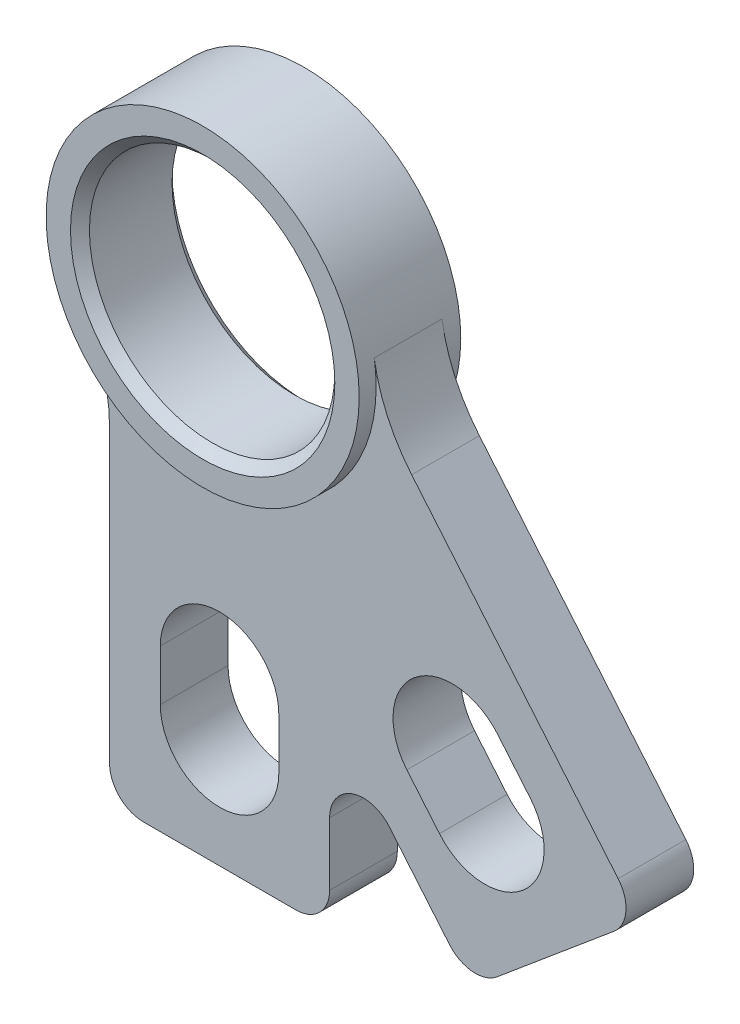
ISO-10303-21;
HEADER;
FILE_DESCRIPTION(('STEP AP214'),'2;1');
FILE_NAME('part.step','',(''),(''),'','','');
FILE_SCHEMA(('AUTOMOTIVE_DESIGN { 1 0 10303 214 1 1 1 1 }'));
ENDSEC;
DATA;
#1=APPLICATION_CONTEXT('core data for automotive mechanical design processes');
#2=APPLICATION_PROTOCOL_DEFINITION('international standard','automotive_design',2000,#1);
#3=PRODUCT_CONTEXT('',#1,'mechanical');
#4=PRODUCT('Part','Part','',(#3));
#5=PRODUCT_RELATED_PRODUCT_CATEGORY('part','',(#4));
#6=PRODUCT_DEFINITION_FORMATION('','',#4);
#7=PRODUCT_DEFINITION_CONTEXT('part definition',#1,'design');
#8=PRODUCT_DEFINITION('design','',#6,#7);
#9=PRODUCT_DEFINITION_SHAPE('','',#8);
#10=(LENGTH_UNIT() NAMED_UNIT(*) SI_UNIT(.MILLI.,.METRE.));
#11=(NAMED_UNIT(*) PLANE_ANGLE_UNIT() SI_UNIT($,.RADIAN.));
#12=(NAMED_UNIT(*) SI_UNIT($,.STERADIAN.) SOLID_ANGLE_UNIT());
#13=UNCERTAINTY_MEASURE_WITH_UNIT(LENGTH_MEASURE(1.E-05),#10,'distance_accuracy_value','');
#14=(GEOMETRIC_REPRESENTATION_CONTEXT(3) GLOBAL_UNCERTAINTY_ASSIGNED_CONTEXT((#13)) GLOBAL_UNIT_ASSIGNED_CONTEXT((#10,
#11,#12)) REPRESENTATION_CONTEXT('',''));
#15=CARTESIAN_POINT('',(0.,0.,0.));
#16=DIRECTION('',(0.,0.,1.));
#17=DIRECTION('',(1.,0.,0.));
#18=AXIS2_PLACEMENT_3D('',#15,#16,#17);
#19=CARTESIAN_POINT('',(0.,0.,4.7625));
#20=DIRECTION('',(0.,0.,-1.));
#21=DIRECTION('',(-1.,0.,0.));
#22=AXIS2_PLACEMENT_3D('',#19,#20,#21);
#23=CYLINDRICAL_SURFACE('',#22,11.5062);
#24=CARTESIAN_POINT('',(0.,0.,-3.87350000000002));
#25=DIRECTION('',(0.,0.,1.));
#26=DIRECTION('',(1.,0.,0.));
#27=AXIS2_PLACEMENT_3D('',#24,#25,#26);
#28=CIRCLE('',#27,11.5062);
#29=CARTESIAN_POINT('',(-11.5062,0.,-3.87350000000002));
#30=VERTEX_POINT('',#29);
#31=EDGE_CURVE('E44',#30,#30,#28,.F.);
#32=CARTESIAN_POINT('',(0.,0.,3.87349999999996));
#33=DIRECTION('',(0.,0.,1.));
#34=DIRECTION('',(1.,0.,0.));
#35=AXIS2_PLACEMENT_3D('',#32,#33,#34);
#36=CIRCLE('',#35,11.5062);
#37=CARTESIAN_POINT('',(-11.5062,0.,3.87349999999996));
#38=VERTEX_POINT('',#37);
#39=EDGE_CURVE('E372',#38,#38,#36,.T.);
#40=CARTESIAN_POINT('',(-11.5062,0.,-3.87350000000002));
#41=CARTESIAN_POINT('',(-11.5062,0.,-3.79280208333335));
#42=CARTESIAN_POINT('',(-11.5062,0.,-3.71210416666668));
#43=CARTESIAN_POINT('',(-11.5062,0.,-3.55070833333335));
#44=CARTESIAN_POINT('',(-11.5062,0.,-3.47001041666668));
#45=CARTESIAN_POINT('',(-11.5062,0.,-3.30861458333335));
#46=CARTESIAN_POINT('',(-11.5062,0.,-3.22791666666669));
#47=CARTESIAN_POINT('',(-11.5062,0.,-3.06652083333335));
#48=CARTESIAN_POINT('',(-11.5062,0.,-2.98582291666669));
#49=CARTESIAN_POINT('',(-11.5062,0.,-2.82442708333335));
#50=CARTESIAN_POINT('',(-11.5062,0.,-2.74372916666669));
#51=CARTESIAN_POINT('',(-11.5062,0.,-2.58233333333335));
#52=CARTESIAN_POINT('',(-11.5062,0.,-2.50163541666669));
#53=CARTESIAN_POINT('',(-11.5062,0.,-2.34023958333336));
#54=CARTESIAN_POINT('',(-11.5062,0.,-2.25954166666669));
#55=CARTESIAN_POINT('',(-11.5062,0.,-2.09814583333336));
#56=CARTESIAN_POINT('',(-11.5062,0.,-2.01744791666669));
#57=CARTESIAN_POINT('',(-11.5062,0.,-1.85605208333336));
#58=CARTESIAN_POINT('',(-11.5062,0.,-1.77535416666669));
#59=CARTESIAN_POINT('',(-11.5062,0.,-1.61395833333336));
#60=CARTESIAN_POINT('',(-11.5062,0.,-1.53326041666669));
#61=CARTESIAN_POINT('',(-11.5062,0.,-1.37186458333336));
#62=CARTESIAN_POINT('',(-11.5062,0.,-1.29116666666669));
#63=CARTESIAN_POINT('',(-11.5062,0.,-1.12977083333336));
#64=CARTESIAN_POINT('',(-11.5062,0.,-1.04907291666669));
#65=CARTESIAN_POINT('',(-11.5062,0.,-0.887677083333361));
#66=CARTESIAN_POINT('',(-11.5062,0.,-0.806979166666695));
#67=CARTESIAN_POINT('',(-11.5062,0.,-0.645583333333362));
#68=CARTESIAN_POINT('',(-11.5062,0.,-0.564885416666695));
#69=CARTESIAN_POINT('',(-11.5062,0.,-0.403489583333362));
#70=CARTESIAN_POINT('',(-11.5062,0.,-0.322791666666696));
#71=CARTESIAN_POINT('',(-11.5062,0.,-0.161395833333363));
#72=CARTESIAN_POINT('',(-11.5062,0.,-0.0806979166666968));
#73=CARTESIAN_POINT('',(-11.5062,0.,0.0806979166666361));
#74=CARTESIAN_POINT('',(-11.5062,0.,0.161395833333302));
#75=CARTESIAN_POINT('',(-11.5062,0.,0.322791666666635));
#76=CARTESIAN_POINT('',(-11.5062,0.,0.403489583333302));
#77=CARTESIAN_POINT('',(-11.5062,0.,0.564885416666635));
#78=CARTESIAN_POINT('',(-11.5062,0.,0.645583333333301));
#79=CARTESIAN_POINT('',(-11.5062,0.,0.806979166666634));
#80=CARTESIAN_POINT('',(-11.5062,0.,0.8876770833333));
#81=CARTESIAN_POINT('',(-11.5062,0.,1.04907291666663));
#82=CARTESIAN_POINT('',(-11.5062,0.,1.1297708333333));
#83=CARTESIAN_POINT('',(-11.5062,0.,1.29116666666663));
#84=CARTESIAN_POINT('',(-11.5062,0.,1.3718645833333));
#85=CARTESIAN_POINT('',(-11.5062,0.,1.53326041666663));
#86=CARTESIAN_POINT('',(-11.5062,0.,1.6139583333333));
#87=CARTESIAN_POINT('',(-11.5062,0.,1.77535416666663));
#88=CARTESIAN_POINT('',(-11.5062,0.,1.8560520833333));
#89=CARTESIAN_POINT('',(-11.5062,0.,2.01744791666663));
#90=CARTESIAN_POINT('',(-11.5062,0.,2.0981458333333));
#91=CARTESIAN_POINT('',(-11.5062,0.,2.25954166666663));
#92=CARTESIAN_POINT('',(-11.5062,0.,2.34023958333329));
#93=CARTESIAN_POINT('',(-11.5062,0.,2.50163541666663));
#94=CARTESIAN_POINT('',(-11.5062,0.,2.58233333333329));
#95=CARTESIAN_POINT('',(-11.5062,0.,2.74372916666663));
#96=CARTESIAN_POINT('',(-11.5062,0.,2.82442708333329));
#97=CARTESIAN_POINT('',(-11.5062,0.,2.98582291666663));
#98=CARTESIAN_POINT('',(-11.5062,0.,3.06652083333329));
#99=CARTESIAN_POINT('',(-11.5062,0.,3.22791666666662));
#100=CARTESIAN_POINT('',(-11.5062,0.,3.30861458333329));
#101=CARTESIAN_POINT('',(-11.5062,0.,3.47001041666662));
#102=CARTESIAN_POINT('',(-11.5062,0.,3.55070833333329));
#103=CARTESIAN_POINT('',(-11.5062,0.,3.71210416666662));
#104=CARTESIAN_POINT('',(-11.5062,0.,3.79280208333329));
#105=CARTESIAN_POINT('',(-11.5062,0.,3.87349999999996));
#106=B_SPLINE_CURVE_WITH_KNOTS('',3,(#40,#41,#42,#43,#44,#45,#46,#47,#48,#49,#50,#51,#52,#53,
#54,#55,#56,#57,#58,#59,#60,#61,#62,#63,#64,#65,#66,#67,#68,#69,#70,#71,#72,#73,#74,#75,#76,#77,
#78,#79,#80,#81,#82,#83,#84,#85,#86,#87,#88,#89,#90,#91,#92,#93,#94,#95,#96,#97,#98,#99,#100,
#101,#102,#103,#104,#105),.UNSPECIFIED.,.F.,.F.,(4,2,2,2,2,2,2,2,2,2,2,2,2,2,2,2,2,2,2,2,2,2,2,
2,2,2,2,2,2,2,2,2,4),(0.,0.242093749999998,0.484187499999998,0.726281249999997,
0.968374999999996,1.21046875,1.45256249999999,1.69465624999999,1.93674999999999,
2.17884374999999,2.42093749999999,2.66303124999999,2.90512499999999,3.14721874999999,
3.38931249999999,3.63140624999999,3.87349999999999,4.11559374999999,4.35768749999998,
4.59978124999998,4.84187499999998,5.08396874999998,5.32606249999998,5.56815624999998,
5.81024999999998,6.05234374999998,6.29443749999998,6.53653124999998,6.77862499999998,
7.02071874999997,7.26281249999997,7.50490624999997,7.74699999999997),.UNSPECIFIED.);
#107=EDGE_CURVE('BSEAM36',#30,#38,#106,.T.);
#108=ORIENTED_EDGE('',*,*,#31,.T.);
#109=ORIENTED_EDGE('',*,*,#39,.T.);
#110=ORIENTED_EDGE('',*,*,#107,.T.);
#111=ORIENTED_EDGE('',*,*,#107,.F.);
#112=EDGE_LOOP('',(#108,#110,#109,#111));
#113=FACE_BOUND('',#112,.T.);
#114=ADVANCED_FACE('F36',(#113),#23,.F.);
#115=CARTESIAN_POINT('',(0.,0.,4.7625));
#116=DIRECTION('',(0.,0.,-1.));
#117=DIRECTION('',(-1.,0.,0.));
#118=AXIS2_PLACEMENT_3D('',#115,#116,#117);
#119=CYLINDRICAL_SURFACE('',#118,14.6812000000021);
#120=DIRECTION('',(0.,0.,-1.));
#121=VECTOR('',#120,1.);
#122=CARTESIAN_POINT('',(-12.5851932668338,-7.55979787272811,3.175));
#123=LINE('',#122,#121);
#124=CARTESIAN_POINT('',(-12.58519326683,-7.5597978727302,3.175));
#125=VERTEX_POINT('',#124);
#126=CARTESIAN_POINT('',(-12.5851932668338,-7.55979787272811,-3.175));
#127=VERTEX_POINT('',#126);
#128=EDGE_CURVE('E199',#125,#127,#123,.T.);
#129=ORIENTED_EDGE('',*,*,#128,.F.);
#130=CARTESIAN_POINT('',(0.,0.,3.175));
#131=DIRECTION('',(0.,0.,1.));
#132=DIRECTION('',(1.,0.,0.));
#133=AXIS2_PLACEMENT_3D('',#130,#131,#132);
#134=CIRCLE('',#133,14.6812000000021);
#135=CARTESIAN_POINT('',(14.5024967800887,2.28368574539104,3.175));
#136=VERTEX_POINT('',#135);
#137=EDGE_CURVE('E215',#125,#136,#134,.T.);
#138=ORIENTED_EDGE('',*,*,#137,.T.);
#139=DIRECTION('',(0.,0.,-1.));
#140=VECTOR('',#139,1.);
#141=CARTESIAN_POINT('',(14.5024967800846,2.2836857453904,3.175));
#142=LINE('',#141,#140);
#143=CARTESIAN_POINT('',(14.5024967800846,2.2836857453904,-3.175));
#144=VERTEX_POINT('',#143);
#145=EDGE_CURVE('E255',#136,#144,#142,.T.);
#146=ORIENTED_EDGE('',*,*,#145,.T.);
#147=CARTESIAN_POINT('',(0.,0.,-3.175));
#148=DIRECTION('',(0.,0.,1.));
#149=DIRECTION('',(1.,0.,0.));
#150=AXIS2_PLACEMENT_3D('',#147,#148,#149);
#151=CIRCLE('',#150,14.6812000000021);
#152=EDGE_CURVE('E256',#127,#144,#151,.T.);
#153=ORIENTED_EDGE('',*,*,#152,.F.);
#154=EDGE_LOOP('',(#129,#138,#146,#153));
#155=FACE_BOUND('',#154,.T.);
#156=CARTESIAN_POINT('',(0.,0.,4.7625));
#157=DIRECTION('',(0.,0.,1.));
#158=DIRECTION('',(1.,0.,0.));
#159=AXIS2_PLACEMENT_3D('',#156,#157,#158);
#160=CIRCLE('',#159,14.6812000000021);
#161=CARTESIAN_POINT('',(14.6812000000021,0.,4.7625));
#162=VERTEX_POINT('',#161);
#163=EDGE_CURVE('E322',#162,#162,#160,.T.);
#164=ORIENTED_EDGE('',*,*,#163,.F.);
#165=EDGE_LOOP('',(#164));
#166=FACE_BOUND('',#165,.T.);
#167=CARTESIAN_POINT('',(0.,0.,-4.7625));
#168=DIRECTION('',(0.,0.,1.));
#169=DIRECTION('',(1.,0.,0.));
#170=AXIS2_PLACEMENT_3D('',#167,#168,#169);
#171=CIRCLE('',#170,14.6812000000021);
#172=CARTESIAN_POINT('',(14.6812000000021,0.,-4.7625));
#173=VERTEX_POINT('',#172);
#174=EDGE_CURVE('E310',#173,#173,#171,.T.);
#175=ORIENTED_EDGE('',*,*,#174,.T.);
#176=EDGE_LOOP('',(#175));
#177=FACE_BOUND('',#176,.T.);
#178=ADVANCED_FACE('F393',(#155,#166,#177),#119,.T.);
#179=CARTESIAN_POINT('',(0.,0.,4.7625));
#180=DIRECTION('',(0.,0.,1.));
#181=DIRECTION('',(1.,0.,0.));
#182=AXIS2_PLACEMENT_3D('',#179,#180,#181);
#183=PLANE('',#182);
#184=CARTESIAN_POINT('',(0.,0.,4.7625));
#185=DIRECTION('',(0.,0.,1.));
#186=DIRECTION('',(1.,0.,0.));
#187=AXIS2_PLACEMENT_3D('',#184,#185,#186);
#188=CIRCLE('',#187,12.3952);
#189=CARTESIAN_POINT('',(12.3952,0.,4.7625));
#190=VERTEX_POINT('',#189);
#191=EDGE_CURVE('E11',#190,#190,#188,.F.);
#192=ORIENTED_EDGE('',*,*,#191,.T.);
#193=EDGE_LOOP('',(#192));
#194=FACE_BOUND('',#193,.T.);
#195=ORIENTED_EDGE('',*,*,#163,.T.);
#196=EDGE_LOOP('',(#195));
#197=FACE_BOUND('',#196,.T.);
#198=ADVANCED_FACE('F389',(#194,#197),#183,.T.);
#199=CARTESIAN_POINT('',(0.,0.,-4.7625));
#200=DIRECTION('',(0.,0.,1.));
#201=DIRECTION('',(1.,0.,0.));
#202=AXIS2_PLACEMENT_3D('',#199,#200,#201);
#203=PLANE('',#202);
#204=CARTESIAN_POINT('',(0.,0.,-4.7625));
#205=DIRECTION('',(0.,0.,1.));
#206=DIRECTION('',(1.,0.,0.));
#207=AXIS2_PLACEMENT_3D('',#204,#205,#206);
#208=CIRCLE('',#207,12.3952);
#209=CARTESIAN_POINT('',(12.3952,0.,-4.7625));
#210=VERTEX_POINT('',#209);
#211=EDGE_CURVE('E369',#210,#210,#208,.T.);
#212=ORIENTED_EDGE('',*,*,#211,.T.);
#213=EDGE_LOOP('',(#212));
#214=FACE_BOUND('',#213,.T.);
#215=ORIENTED_EDGE('',*,*,#174,.F.);
#216=EDGE_LOOP('',(#215));
#217=FACE_BOUND('',#216,.T.);
#218=ADVANCED_FACE('F385',(#214,#217),#203,.F.);
#219=CARTESIAN_POINT('',(4.33333924299006E-12,-31.1330697939331,3.175));
#220=DIRECTION('',(0.,0.,-1.));
#221=DIRECTION('',(-1.,0.,0.));
#222=AXIS2_PLACEMENT_3D('',#219,#220,#221);
#223=CYLINDRICAL_SURFACE('',#222,5.5562499999984);
#224=CARTESIAN_POINT('',(4.33333924299006E-12,-31.1330697939331,-3.175));
#225=DIRECTION('',(0.,0.,1.));
#226=DIRECTION('',(1.,0.,0.));
#227=AXIS2_PLACEMENT_3D('',#224,#225,#226);
#228=CIRCLE('',#227,5.5562499999984);
#229=CARTESIAN_POINT('',(5.55625000000273,-31.1330697939331,-3.175));
#230=VERTEX_POINT('',#229);
#231=CARTESIAN_POINT('',(-5.55624999999407,-31.1330697939331,-3.175));
#232=VERTEX_POINT('',#231);
#233=EDGE_CURVE('E290',#230,#232,#228,.T.);
#234=ORIENTED_EDGE('',*,*,#233,.F.);
#235=DIRECTION('',(0.,0.,-1.));
#236=VECTOR('',#235,1.);
#237=CARTESIAN_POINT('',(5.55625000000273,-31.1330697939331,3.175));
#238=LINE('',#237,#236);
#239=CARTESIAN_POINT('',(5.55625000000273,-31.1330697939331,3.175));
#240=VERTEX_POINT('',#239);
#241=EDGE_CURVE('E308',#240,#230,#238,.T.);
#242=ORIENTED_EDGE('',*,*,#241,.F.);
#243=CARTESIAN_POINT('',(4.33333924299006E-12,-31.1330697939331,3.175));
#244=DIRECTION('',(0.,0.,1.));
#245=DIRECTION('',(1.,0.,0.));
#246=AXIS2_PLACEMENT_3D('',#243,#244,#245);
#247=CIRCLE('',#246,5.5562499999984);
#248=CARTESIAN_POINT('',(-5.55624999999407,-31.1330697939331,3.175));
#249=VERTEX_POINT('',#248);
#250=EDGE_CURVE('E244',#240,#249,#247,.T.);
#251=ORIENTED_EDGE('',*,*,#250,.T.);
#252=DIRECTION('',(0.,0.,-1.));
#253=VECTOR('',#252,1.);
#254=CARTESIAN_POINT('',(-5.55624999999407,-31.1330697939331,3.175));
#255=LINE('',#254,#253);
#256=EDGE_CURVE('E301',#249,#232,#255,.T.);
#257=ORIENTED_EDGE('',*,*,#256,.T.);
#258=EDGE_LOOP('',(#234,#242,#251,#257));
#259=FACE_BOUND('',#258,.T.);
#260=ADVANCED_FACE('F388',(#259),#223,.F.);
#261=CARTESIAN_POINT('',(5.55625000000273,0.,3.175));
#262=DIRECTION('',(-1.,0.,0.));
#263=DIRECTION('',(0.,0.,1.));
#264=AXIS2_PLACEMENT_3D('',#261,#262,#263);
#265=PLANE('',#264);
#266=DIRECTION('',(0.,1.,0.));
#267=VECTOR('',#266,1.);
#268=CARTESIAN_POINT('',(5.55625000000273,0.,-3.175));
#269=LINE('',#268,#267);
#270=CARTESIAN_POINT('',(5.55625000000273,-35.8955697939363,-3.175));
#271=VERTEX_POINT('',#270);
#272=EDGE_CURVE('E293',#271,#230,#269,.T.);
#273=ORIENTED_EDGE('',*,*,#272,.F.);
#274=DIRECTION('',(0.,0.,-1.));
#275=VECTOR('',#274,1.);
#276=CARTESIAN_POINT('',(5.55625000000273,-35.8955697939363,3.175));
#277=LINE('',#276,#275);
#278=CARTESIAN_POINT('',(5.55625000000273,-35.8955697939363,3.175));
#279=VERTEX_POINT('',#278);
#280=EDGE_CURVE('E306',#279,#271,#277,.T.);
#281=ORIENTED_EDGE('',*,*,#280,.F.);
#282=DIRECTION('',(0.,1.,0.));
#283=VECTOR('',#282,1.);
#284=CARTESIAN_POINT('',(5.55625000000273,0.,3.175));
#285=LINE('',#284,#283);
#286=EDGE_CURVE('E247',#279,#240,#285,.T.);
#287=ORIENTED_EDGE('',*,*,#286,.T.);
#288=ORIENTED_EDGE('',*,*,#241,.T.);
#289=EDGE_LOOP('',(#273,#281,#287,#288));
#290=FACE_BOUND('',#289,.T.);
#291=ADVANCED_FACE('F531',(#290),#265,.T.);
#292=CARTESIAN_POINT('',(4.32900243430012E-12,-35.8955697939363,3.175));
#293=DIRECTION('',(0.,0.,-1.));
#294=DIRECTION('',(-1.,0.,0.));
#295=AXIS2_PLACEMENT_3D('',#292,#293,#294);
#296=CYLINDRICAL_SURFACE('',#295,5.5562499999984);
#297=CARTESIAN_POINT('',(4.32900243430012E-12,-35.8955697939363,-3.175));
#298=DIRECTION('',(0.,0.,1.));
#299=DIRECTION('',(1.,0.,0.));
#300=AXIS2_PLACEMENT_3D('',#297,#298,#299);
#301=CIRCLE('',#300,5.5562499999984);
#302=CARTESIAN_POINT('',(-5.55624999999407,-35.8955697939363,-3.175));
#303=VERTEX_POINT('',#302);
#304=EDGE_CURVE('E296',#303,#271,#301,.T.);
#305=ORIENTED_EDGE('',*,*,#304,.F.);
#306=DIRECTION('',(0.,0.,-1.));
#307=VECTOR('',#306,1.);
#308=CARTESIAN_POINT('',(-5.55624999999407,-35.8955697939363,3.175));
#309=LINE('',#308,#307);
#310=CARTESIAN_POINT('',(-5.55624999999407,-35.8955697939363,3.175));
#311=VERTEX_POINT('',#310);
#312=EDGE_CURVE('E303',#311,#303,#309,.T.);
#313=ORIENTED_EDGE('',*,*,#312,.F.);
#314=CARTESIAN_POINT('',(4.32900243430012E-12,-35.8955697939363,3.175));
#315=DIRECTION('',(0.,0.,1.));
#316=DIRECTION('',(1.,0.,0.));
#317=AXIS2_PLACEMENT_3D('',#314,#315,#316);
#318=CIRCLE('',#317,5.5562499999984);
#319=EDGE_CURVE('E250',#311,#279,#318,.T.);
#320=ORIENTED_EDGE('',*,*,#319,.T.);
#321=ORIENTED_EDGE('',*,*,#280,.T.);
#322=EDGE_LOOP('',(#305,#313,#320,#321));
#323=FACE_BOUND('',#322,.T.);
#324=ADVANCED_FACE('F498',(#323),#296,.F.);
#325=CARTESIAN_POINT('',(21.8221681831767,-26.0605412587968,3.175));
#326=DIRECTION('',(0.,0.,-1.));
#327=DIRECTION('',(-1.,0.,0.));
#328=AXIS2_PLACEMENT_3D('',#325,#326,#327);
#329=CYLINDRICAL_SURFACE('',#328,5.55624999999838);
#330=CARTESIAN_POINT('',(21.8221681831767,-26.0605412587968,-3.175));
#331=DIRECTION('',(0.,0.,1.));
#332=DIRECTION('',(1.,0.,0.));
#333=AXIS2_PLACEMENT_3D('',#330,#331,#332);
#334=CIRCLE('',#333,5.55624999999838);
#335=CARTESIAN_POINT('',(26.0821403827308,-22.493392408313,-3.175));
#336=VERTEX_POINT('',#335);
#337=CARTESIAN_POINT('',(17.5621959836225,-29.6276901092805,-3.175));
#338=VERTEX_POINT('',#337);
#339=EDGE_CURVE('E278',#336,#338,#334,.T.);
#340=ORIENTED_EDGE('',*,*,#339,.F.);
#341=DIRECTION('',(0.,0.,-1.));
#342=VECTOR('',#341,1.);
#343=CARTESIAN_POINT('',(26.0821403827308,-22.493392408313,3.175));
#344=LINE('',#343,#342);
#345=CARTESIAN_POINT('',(26.0821403827308,-22.493392408313,3.175));
#346=VERTEX_POINT('',#345);
#347=EDGE_CURVE('E304',#346,#336,#344,.T.);
#348=ORIENTED_EDGE('',*,*,#347,.F.);
#349=CARTESIAN_POINT('',(21.8221681831767,-26.0605412587968,3.175));
#350=DIRECTION('',(0.,0.,1.));
#351=DIRECTION('',(1.,0.,0.));
#352=AXIS2_PLACEMENT_3D('',#349,#350,#351);
#353=CIRCLE('',#352,5.55624999999838);
#354=CARTESIAN_POINT('',(17.5621959836225,-29.6276901092805,3.175));
#355=VERTEX_POINT('',#354);
#356=EDGE_CURVE('E233',#346,#355,#353,.T.);
#357=ORIENTED_EDGE('',*,*,#356,.T.);
#358=DIRECTION('',(0.,0.,-1.));
#359=VECTOR('',#358,1.);
#360=CARTESIAN_POINT('',(17.5621959836225,-29.6276901092805,3.175));
#361=LINE('',#360,#359);
#362=EDGE_CURVE('E311',#355,#338,#361,.T.);
#363=ORIENTED_EDGE('',*,*,#362,.T.);
#364=EDGE_LOOP('',(#340,#348,#357,#363));
#365=FACE_BOUND('',#364,.T.);
#366=ADVANCED_FACE('F490',(#365),#329,.F.);
#367=CARTESIAN_POINT('',(4.25997219955788,3.56714885048686,3.175));
#368=DIRECTION('',(-0.766699158525159,-0.64200654226948,0.));
#369=DIRECTION('',(0.64200654226948,-0.766699158525159,0.));
#370=AXIS2_PLACEMENT_3D('',#367,#368,#369);
#371=PLANE('',#370);
#372=DIRECTION('',(-0.64200654226948,0.766699158525159,0.));
#373=VECTOR('',#372,1.);
#374=CARTESIAN_POINT('',(4.25997219955788,3.56714885048686,-3.175));
#375=LINE('',#374,#373);
#376=CARTESIAN_POINT('',(29.1396965402913,-26.1447971507915,-3.175));
#377=VERTEX_POINT('',#376);
#378=EDGE_CURVE('E281',#377,#336,#375,.T.);
#379=ORIENTED_EDGE('',*,*,#378,.F.);
#380=DIRECTION('',(0.,0.,-1.));
#381=VECTOR('',#380,1.);
#382=CARTESIAN_POINT('',(29.1396965402913,-26.1447971507915,3.175));
#383=LINE('',#382,#381);
#384=CARTESIAN_POINT('',(29.1396965402913,-26.1447971507915,3.175));
#385=VERTEX_POINT('',#384);
#386=EDGE_CURVE('E315',#385,#377,#383,.T.);
#387=ORIENTED_EDGE('',*,*,#386,.F.);
#388=DIRECTION('',(-0.64200654226948,0.766699158525159,0.));
#389=VECTOR('',#388,1.);
#390=CARTESIAN_POINT('',(4.25997219955788,3.56714885048686,3.175));
#391=LINE('',#390,#389);
#392=EDGE_CURVE('E236',#385,#346,#391,.T.);
#393=ORIENTED_EDGE('',*,*,#392,.T.);
#394=ORIENTED_EDGE('',*,*,#347,.T.);
#395=EDGE_LOOP('',(#379,#387,#393,#394));
#396=FACE_BOUND('',#395,.T.);
#397=ADVANCED_FACE('F484',(#396),#371,.T.);
#398=CARTESIAN_POINT('',(24.8797243407371,-29.7119460012753,3.175));
#399=DIRECTION('',(0.,0.,-1.));
#400=DIRECTION('',(-1.,0.,0.));
#401=AXIS2_PLACEMENT_3D('',#398,#399,#400);
#402=CYLINDRICAL_SURFACE('',#401,5.55624999999838);
#403=CARTESIAN_POINT('',(24.8797243407371,-29.7119460012753,-3.175));
#404=DIRECTION('',(0.,0.,1.));
#405=DIRECTION('',(1.,0.,0.));
#406=AXIS2_PLACEMENT_3D('',#403,#404,#405);
#407=CIRCLE('',#406,5.55624999999838);
#408=CARTESIAN_POINT('',(20.6197521411829,-33.279094851759,-3.175));
#409=VERTEX_POINT('',#408);
#410=EDGE_CURVE('E284',#409,#377,#407,.T.);
#411=ORIENTED_EDGE('',*,*,#410,.F.);
#412=DIRECTION('',(0.,0.,-1.));
#413=VECTOR('',#412,1.);
#414=CARTESIAN_POINT('',(20.6197521411829,-33.279094851759,3.175));
#415=LINE('',#414,#413);
#416=CARTESIAN_POINT('',(20.6197521411829,-33.279094851759,3.175));
#417=VERTEX_POINT('',#416);
#418=EDGE_CURVE('E313',#417,#409,#415,.T.);
#419=ORIENTED_EDGE('',*,*,#418,.F.);
#420=CARTESIAN_POINT('',(24.8797243407371,-29.7119460012753,3.175));
#421=DIRECTION('',(0.,0.,1.));
#422=DIRECTION('',(1.,0.,0.));
#423=AXIS2_PLACEMENT_3D('',#420,#421,#422);
#424=CIRCLE('',#423,5.55624999999838);
#425=EDGE_CURVE('E239',#417,#385,#424,.T.);
#426=ORIENTED_EDGE('',*,*,#425,.T.);
#427=ORIENTED_EDGE('',*,*,#386,.T.);
#428=EDGE_LOOP('',(#411,#419,#426,#427));
#429=FACE_BOUND('',#428,.T.);
#430=ADVANCED_FACE('F480',(#429),#402,.F.);
#431=CARTESIAN_POINT('',(-26.1937499999936,-15.7343197939348,3.175));
#432=DIRECTION('',(0.,0.,-1.));
#433=DIRECTION('',(-1.,0.,0.));
#434=AXIS2_PLACEMENT_3D('',#431,#432,#433);
#435=CYLINDRICAL_SURFACE('',#434,15.8749999999996);
#436=CARTESIAN_POINT('',(-26.1937499999936,-15.7343197939348,-3.175));
#437=DIRECTION('',(0.,0.,1.));
#438=DIRECTION('',(1.,0.,0.));
#439=AXIS2_PLACEMENT_3D('',#436,#437,#438);
#440=CIRCLE('',#439,15.8749999999996);
#441=CARTESIAN_POINT('',(-10.3187499999941,-15.7343197939348,-3.175));
#442=VERTEX_POINT('',#441);
#443=EDGE_CURVE('E195',#442,#127,#440,.T.);
#444=ORIENTED_EDGE('',*,*,#443,.F.);
#445=DIRECTION('',(0.,0.,-1.));
#446=VECTOR('',#445,1.);
#447=CARTESIAN_POINT('',(-10.3187499999941,-15.7343197939348,3.175));
#448=LINE('',#447,#446);
#449=CARTESIAN_POINT('',(-10.3187499999941,-15.7343197939348,3.175));
#450=VERTEX_POINT('',#449);
#451=EDGE_CURVE('E188',#450,#442,#448,.T.);
#452=ORIENTED_EDGE('',*,*,#451,.F.);
#453=CARTESIAN_POINT('',(-26.1937499999936,-15.7343197939348,3.175));
#454=DIRECTION('',(0.,0.,1.));
#455=DIRECTION('',(1.,0.,0.));
#456=AXIS2_PLACEMENT_3D('',#453,#454,#455);
#457=CIRCLE('',#456,15.8749999999996);
#458=EDGE_CURVE('E193',#450,#125,#457,.T.);
#459=ORIENTED_EDGE('',*,*,#458,.T.);
#460=ORIENTED_EDGE('',*,*,#128,.T.);
#461=EDGE_LOOP('',(#444,#452,#459,#460));
#462=FACE_BOUND('',#461,.T.);
#463=ADVANCED_FACE('F190',(#462),#435,.F.);
#464=CARTESIAN_POINT('',(-10.318749999994,0.,3.175));
#465=DIRECTION('',(1.,0.,0.));
#466=DIRECTION('',(0.,1.,0.));
#467=AXIS2_PLACEMENT_3D('',#464,#465,#466);
#468=PLANE('',#467);
#469=DIRECTION('',(0.,-1.,0.));
#470=VECTOR('',#469,1.);
#471=CARTESIAN_POINT('',(-10.318749999994,0.,-3.175));
#472=LINE('',#471,#470);
#473=CARTESIAN_POINT('',(-10.3187499999941,-43.0393197939347,-3.175));
#474=VERTEX_POINT('',#473);
#475=EDGE_CURVE('E260',#442,#474,#472,.T.);
#476=ORIENTED_EDGE('',*,*,#475,.T.);
#477=DIRECTION('',(0.,0.,-1.));
#478=VECTOR('',#477,1.);
#479=CARTESIAN_POINT('',(-10.3187499999941,-43.0393197939347,3.175));
#480=LINE('',#479,#478);
#481=CARTESIAN_POINT('',(-10.3187499999941,-43.0393197939347,3.175));
#482=VERTEX_POINT('',#481);
#483=EDGE_CURVE('E206',#474,#482,#480,.F.);
#484=ORIENTED_EDGE('',*,*,#483,.T.);
#485=DIRECTION('',(0.,-1.,0.));
#486=VECTOR('',#485,1.);
#487=CARTESIAN_POINT('',(-10.318749999994,0.,3.175));
#488=LINE('',#487,#486);
#489=EDGE_CURVE('E203',#450,#482,#488,.T.);
#490=ORIENTED_EDGE('',*,*,#489,.F.);
#491=ORIENTED_EDGE('',*,*,#451,.T.);
#492=EDGE_LOOP('',(#476,#484,#490,#491));
#493=FACE_BOUND('',#492,.T.);
#494=ADVANCED_FACE('F204',(#493),#468,.F.);
#495=CARTESIAN_POINT('',(0.,-46.2143197939347,3.175));
#496=DIRECTION('',(0.,1.,0.));
#497=DIRECTION('',(-1.,0.,0.));
#498=AXIS2_PLACEMENT_3D('',#495,#496,#497);
#499=PLANE('',#498);
#500=DIRECTION('',(1.,0.,0.));
#501=VECTOR('',#500,1.);
#502=CARTESIAN_POINT('',(0.,-46.2143197939347,-3.175));
#503=LINE('',#502,#501);
#504=CARTESIAN_POINT('',(-7.14374999999407,-46.2143197939346,-3.175));
#505=VERTEX_POINT('',#504);
#506=CARTESIAN_POINT('',(7.14375000000272,-46.2143197939347,-3.175));
#507=VERTEX_POINT('',#506);
#508=EDGE_CURVE('E262',#505,#507,#503,.T.);
#509=ORIENTED_EDGE('',*,*,#508,.T.);
#510=DIRECTION('',(0.,0.,-1.));
#511=VECTOR('',#510,1.);
#512=CARTESIAN_POINT('',(7.14375000000272,-46.2143197939347,3.175));
#513=LINE('',#512,#511);
#514=CARTESIAN_POINT('',(7.14375000000272,-46.2143197939347,3.175));
#515=VERTEX_POINT('',#514);
#516=EDGE_CURVE('E59',#507,#515,#513,.F.);
#517=ORIENTED_EDGE('',*,*,#516,.T.);
#518=DIRECTION('',(1.,0.,0.));
#519=VECTOR('',#518,1.);
#520=CARTESIAN_POINT('',(0.,-46.2143197939347,3.175));
#521=LINE('',#520,#519);
#522=CARTESIAN_POINT('',(-7.14374999999407,-46.2143197939346,3.175));
#523=VERTEX_POINT('',#522);
#524=EDGE_CURVE('E208',#523,#515,#521,.T.);
#525=ORIENTED_EDGE('',*,*,#524,.F.);
#526=DIRECTION('',(0.,0.,-1.));
#527=VECTOR('',#526,1.);
#528=CARTESIAN_POINT('',(-7.14374999999407,-46.2143197939346,3.175));
#529=LINE('',#528,#527);
#530=EDGE_CURVE('E357',#523,#505,#529,.T.);
#531=ORIENTED_EDGE('',*,*,#530,.T.);
#532=EDGE_LOOP('',(#509,#517,#525,#531));
#533=FACE_BOUND('',#532,.T.);
#534=ADVANCED_FACE('F444',(#533),#499,.F.);
#535=CARTESIAN_POINT('',(10.3187500000027,0.,3.175));
#536=DIRECTION('',(-1.,0.,0.));
#537=DIRECTION('',(0.,-1.,0.));
#538=AXIS2_PLACEMENT_3D('',#535,#536,#537);
#539=PLANE('',#538);
#540=DIRECTION('',(0.,1.,0.));
#541=VECTOR('',#540,1.);
#542=CARTESIAN_POINT('',(10.3187500000027,0.,-3.175));
#543=LINE('',#542,#541);
#544=CARTESIAN_POINT('',(10.3187500000027,-43.0393197939347,-3.175));
#545=VERTEX_POINT('',#544);
#546=CARTESIAN_POINT('',(10.3187500000027,-37.1326383779093,-3.175));
#547=VERTEX_POINT('',#546);
#548=EDGE_CURVE('E264',#545,#547,#543,.T.);
#549=ORIENTED_EDGE('',*,*,#548,.T.);
#550=DIRECTION('',(0.,0.,-1.));
#551=VECTOR('',#550,1.);
#552=CARTESIAN_POINT('',(10.3187500000027,-37.1326383779093,3.175));
#553=LINE('',#552,#551);
#554=CARTESIAN_POINT('',(10.3187500000027,-37.1326383779093,3.175));
#555=VERTEX_POINT('',#554);
#556=EDGE_CURVE('E335',#547,#555,#553,.F.);
#557=ORIENTED_EDGE('',*,*,#556,.T.);
#558=DIRECTION('',(0.,1.,0.));
#559=VECTOR('',#558,1.);
#560=CARTESIAN_POINT('',(10.3187500000027,0.,3.175));
#561=LINE('',#560,#559);
#562=CARTESIAN_POINT('',(10.3187500000027,-43.0393197939347,3.175));
#563=VERTEX_POINT('',#562);
#564=EDGE_CURVE('E221',#563,#555,#561,.T.);
#565=ORIENTED_EDGE('',*,*,#564,.F.);
#566=DIRECTION('',(0.,0.,-1.));
#567=VECTOR('',#566,1.);
#568=CARTESIAN_POINT('',(10.3187500000027,-43.0393197939347,3.175));
#569=LINE('',#568,#567);
#570=EDGE_CURVE('E332',#563,#545,#569,.T.);
#571=ORIENTED_EDGE('',*,*,#570,.T.);
#572=EDGE_LOOP('',(#549,#557,#565,#571));
#573=FACE_BOUND('',#572,.T.);
#574=ADVANCED_FACE('F449',(#573),#539,.F.);
#575=CARTESIAN_POINT('',(-7.91137694202655,-6.62470500803907,3.175));
#576=DIRECTION('',(-0.766699158525159,-0.64200654226948,0.));
#577=DIRECTION('',(0.64200654226948,-0.766699158525159,0.));
#578=AXIS2_PLACEMENT_3D('',#575,#576,#577);
#579=PLANE('',#578);
#580=DIRECTION('',(-0.64200654226948,0.766699158525159,0.));
#581=VECTOR('',#580,1.);
#582=CARTESIAN_POINT('',(-7.91137694202655,-6.62470500803907,3.175));
#583=LINE('',#582,#581);
#584=CARTESIAN_POINT('',(21.5546816350434,-41.8137581230303,3.175));
#585=VERTEX_POINT('',#584);
#586=CARTESIAN_POINT('',(15.9280198283201,-35.0942676062037,3.175));
#587=VERTEX_POINT('',#586);
#588=EDGE_CURVE('E224',#585,#587,#583,.T.);
#589=ORIENTED_EDGE('',*,*,#588,.T.);
#590=DIRECTION('',(0.,0.,-1.));
#591=VECTOR('',#590,1.);
#592=CARTESIAN_POINT('',(15.9280198283201,-35.0942676062037,3.175));
#593=LINE('',#592,#591);
#594=CARTESIAN_POINT('',(15.9280198283201,-35.0942676062037,-3.175));
#595=VERTEX_POINT('',#594);
#596=EDGE_CURVE('E329',#587,#595,#593,.T.);
#597=ORIENTED_EDGE('',*,*,#596,.T.);
#598=DIRECTION('',(-0.64200654226948,0.766699158525159,0.));
#599=VECTOR('',#598,1.);
#600=CARTESIAN_POINT('',(-7.91137694202655,-6.62470500803907,-3.175));
#601=LINE('',#600,#599);
#602=CARTESIAN_POINT('',(21.5546816350434,-41.8137581230303,-3.175));
#603=VERTEX_POINT('',#602);
#604=EDGE_CURVE('E267',#603,#595,#601,.T.);
#605=ORIENTED_EDGE('',*,*,#604,.F.);
#606=DIRECTION('',(0.,0.,-1.));
#607=VECTOR('',#606,1.);
#608=CARTESIAN_POINT('',(21.5546816350434,-41.8137581230303,3.175));
#609=LINE('',#608,#607);
#610=EDGE_CURVE('E325',#603,#585,#609,.F.);
#611=ORIENTED_EDGE('',*,*,#610,.T.);
#612=EDGE_LOOP('',(#589,#597,#605,#611));
#613=FACE_BOUND('',#612,.T.);
#614=ADVANCED_FACE('F455',(#613),#579,.T.);
#615=CARTESIAN_POINT('',(31.5044293487756,-37.6233229433087,3.175));
#616=DIRECTION('',(-0.642006542269479,0.766699158525159,0.));
#617=DIRECTION('',(-0.766699158525159,-0.642006542269479,0.));
#618=AXIS2_PLACEMENT_3D('',#615,#616,#617);
#619=PLANE('',#618);
#620=DIRECTION('',(0.766699158525159,0.642006542269479,0.));
#621=VECTOR('',#620,1.);
#622=CARTESIAN_POINT('',(31.5044293487756,-37.6233229433087,3.175));
#623=LINE('',#622,#621);
#624=CARTESIAN_POINT('',(26.0273222350664,-42.2096571796421,3.175));
#625=VERTEX_POINT('',#624);
#626=CARTESIAN_POINT('',(36.9815364624922,-33.036988706969,3.175));
#627=VERTEX_POINT('',#626);
#628=EDGE_CURVE('E227',#625,#627,#623,.T.);
#629=ORIENTED_EDGE('',*,*,#628,.F.);
#630=DIRECTION('',(0.,0.,-1.));
#631=VECTOR('',#630,1.);
#632=CARTESIAN_POINT('',(26.0273222350664,-42.2096571796421,-3.175));
#633=LINE('',#632,#631);
#634=CARTESIAN_POINT('',(26.0273222350664,-42.2096571796421,-3.175));
#635=VERTEX_POINT('',#634);
#636=EDGE_CURVE('E339',#625,#635,#633,.T.);
#637=ORIENTED_EDGE('',*,*,#636,.T.);
#638=DIRECTION('',(0.766699158525159,0.642006542269479,0.));
#639=VECTOR('',#638,1.);
#640=CARTESIAN_POINT('',(31.5044293487756,-37.6233229433087,-3.175));
#641=LINE('',#640,#639);
#642=CARTESIAN_POINT('',(36.9815364624922,-33.036988706969,-3.175));
#643=VERTEX_POINT('',#642);
#644=EDGE_CURVE('E270',#635,#643,#641,.T.);
#645=ORIENTED_EDGE('',*,*,#644,.T.);
#646=DIRECTION('',(0.,0.,-1.));
#647=VECTOR('',#646,1.);
#648=CARTESIAN_POINT('',(36.9815364624922,-33.036988706969,3.175));
#649=LINE('',#648,#647);
#650=EDGE_CURVE('E337',#643,#627,#649,.F.);
#651=ORIENTED_EDGE('',*,*,#650,.T.);
#652=EDGE_LOOP('',(#629,#637,#645,#651));
#653=FACE_BOUND('',#652,.T.);
#654=ADVANCED_FACE('F461',(#653),#619,.F.);
#655=CARTESIAN_POINT('',(7.91137694203392,6.62470500804524,3.175));
#656=DIRECTION('',(-0.766699158525159,-0.64200654226948,0.));
#657=DIRECTION('',(0.64200654226948,-0.766699158525159,0.));
#658=AXIS2_PLACEMENT_3D('',#655,#656,#657);
#659=PLANE('',#658);
#660=DIRECTION('',(-0.64200654226948,0.766699158525159,0.));
#661=VECTOR('',#660,1.);
#662=CARTESIAN_POINT('',(7.91137694203392,6.62470500804524,3.175));
#663=LINE('',#662,#661);
#664=CARTESIAN_POINT('',(37.3774355191039,-28.564348106946,3.175));
#665=VERTEX_POINT('',#664);
#666=CARTESIAN_POINT('',(18.0129131879008,-5.43878473793098,3.175));
#667=VERTEX_POINT('',#666);
#668=EDGE_CURVE('E229',#665,#667,#663,.T.);
#669=ORIENTED_EDGE('',*,*,#668,.F.);
#670=DIRECTION('',(0.,0.,-1.));
#671=VECTOR('',#670,1.);
#672=CARTESIAN_POINT('',(37.3774355191039,-28.564348106946,3.175));
#673=LINE('',#672,#671);
#674=CARTESIAN_POINT('',(37.3774355191039,-28.564348106946,-3.175));
#675=VERTEX_POINT('',#674);
#676=EDGE_CURVE('E362',#665,#675,#673,.T.);
#677=ORIENTED_EDGE('',*,*,#676,.T.);
#678=DIRECTION('',(-0.64200654226948,0.766699158525159,0.));
#679=VECTOR('',#678,1.);
#680=CARTESIAN_POINT('',(7.91137694203392,6.62470500804524,-3.175));
#681=LINE('',#680,#679);
#682=CARTESIAN_POINT('',(18.0129131879008,-5.43878473793098,-3.175));
#683=VERTEX_POINT('',#682);
#684=EDGE_CURVE('E273',#675,#683,#681,.T.);
#685=ORIENTED_EDGE('',*,*,#684,.T.);
#686=DIRECTION('',(0.,0.,-1.));
#687=VECTOR('',#686,1.);
#688=CARTESIAN_POINT('',(18.0129131879008,-5.43878473793098,3.175));
#689=LINE('',#688,#687);
#690=EDGE_CURVE('E200',#667,#683,#689,.T.);
#691=ORIENTED_EDGE('',*,*,#690,.F.);
#692=EDGE_LOOP('',(#669,#677,#685,#691));
#693=FACE_BOUND('',#692,.T.);
#694=ADVANCED_FACE('F431',(#693),#659,.F.);
#695=CARTESIAN_POINT('',(-4.25997219955047,-3.56714885048066,3.175));
#696=DIRECTION('',(-0.766699158525159,-0.64200654226948,0.));
#697=DIRECTION('',(0.64200654226948,-0.766699158525159,0.));
#698=AXIS2_PLACEMENT_3D('',#695,#696,#697);
#699=PLANE('',#698);
#700=DIRECTION('',(-0.64200654226948,0.766699158525159,0.));
#701=VECTOR('',#700,1.);
#702=CARTESIAN_POINT('',(-4.25997219955047,-3.56714885048066,-3.175));
#703=LINE('',#702,#701);
#704=EDGE_CURVE('E287',#409,#338,#703,.T.);
#705=ORIENTED_EDGE('',*,*,#704,.T.);
#706=ORIENTED_EDGE('',*,*,#362,.F.);
#707=DIRECTION('',(-0.64200654226948,0.766699158525159,0.));
#708=VECTOR('',#707,1.);
#709=CARTESIAN_POINT('',(-4.25997219955047,-3.56714885048066,3.175));
#710=LINE('',#709,#708);
#711=EDGE_CURVE('E242',#417,#355,#710,.T.);
#712=ORIENTED_EDGE('',*,*,#711,.F.);
#713=ORIENTED_EDGE('',*,*,#418,.T.);
#714=EDGE_LOOP('',(#705,#706,#712,#713));
#715=FACE_BOUND('',#714,.T.);
#716=ADVANCED_FACE('F468',(#715),#699,.F.);
#717=CARTESIAN_POINT('',(30.1842623294873,4.75306912059681,3.175));
#718=DIRECTION('',(0.,0.,-1.));
#719=DIRECTION('',(-1.,0.,0.));
#720=AXIS2_PLACEMENT_3D('',#717,#718,#719);
#721=CYLINDRICAL_SURFACE('',#720,15.8750000000016);
#722=CARTESIAN_POINT('',(30.1842623294873,4.75306912059681,-3.175));
#723=DIRECTION('',(0.,0.,1.));
#724=DIRECTION('',(1.,0.,0.));
#725=AXIS2_PLACEMENT_3D('',#722,#723,#724);
#726=CIRCLE('',#725,15.8750000000016);
#727=EDGE_CURVE('E275',#683,#144,#726,.F.);
#728=ORIENTED_EDGE('',*,*,#727,.T.);
#729=ORIENTED_EDGE('',*,*,#145,.F.);
#730=CARTESIAN_POINT('',(30.1842623294873,4.75306912059681,3.175));
#731=DIRECTION('',(0.,0.,1.));
#732=DIRECTION('',(1.,0.,0.));
#733=AXIS2_PLACEMENT_3D('',#730,#731,#732);
#734=CIRCLE('',#733,15.8750000000016);
#735=EDGE_CURVE('E231',#667,#136,#734,.F.);
#736=ORIENTED_EDGE('',*,*,#735,.F.);
#737=ORIENTED_EDGE('',*,*,#690,.T.);
#738=EDGE_LOOP('',(#728,#729,#736,#737));
#739=FACE_BOUND('',#738,.T.);
#740=ADVANCED_FACE('F439',(#739),#721,.F.);
#741=CARTESIAN_POINT('',(-5.55624999999407,0.,3.175));
#742=DIRECTION('',(-1.,0.,0.));
#743=DIRECTION('',(0.,0.,1.));
#744=AXIS2_PLACEMENT_3D('',#741,#742,#743);
#745=PLANE('',#744);
#746=DIRECTION('',(0.,1.,0.));
#747=VECTOR('',#746,1.);
#748=CARTESIAN_POINT('',(-5.55624999999407,0.,-3.175));
#749=LINE('',#748,#747);
#750=EDGE_CURVE('E217',#303,#232,#749,.T.);
#751=ORIENTED_EDGE('',*,*,#750,.T.);
#752=ORIENTED_EDGE('',*,*,#256,.F.);
#753=DIRECTION('',(0.,1.,0.));
#754=VECTOR('',#753,1.);
#755=CARTESIAN_POINT('',(-5.55624999999407,0.,3.175));
#756=LINE('',#755,#754);
#757=EDGE_CURVE('E253',#311,#249,#756,.T.);
#758=ORIENTED_EDGE('',*,*,#757,.F.);
#759=ORIENTED_EDGE('',*,*,#312,.T.);
#760=EDGE_LOOP('',(#751,#752,#758,#759));
#761=FACE_BOUND('',#760,.T.);
#762=ADVANCED_FACE('F501',(#761),#745,.F.);
#763=CARTESIAN_POINT('',(0.,0.,3.175));
#764=DIRECTION('',(0.,0.,1.));
#765=DIRECTION('',(1.,0.,0.));
#766=AXIS2_PLACEMENT_3D('',#763,#764,#765);
#767=PLANE('',#766);
#768=ORIENTED_EDGE('',*,*,#588,.F.);
#769=CARTESIAN_POINT('',(23.9889514633608,-39.7753873513247,3.175));
#770=DIRECTION('',(0.,0.,1.));
#771=DIRECTION('',(1.,0.,0.));
#772=AXIS2_PLACEMENT_3D('',#769,#770,#771);
#773=CIRCLE('',#772,3.175);
#774=EDGE_CURVE('E355',#585,#625,#773,.T.);
#775=ORIENTED_EDGE('',*,*,#774,.T.);
#776=ORIENTED_EDGE('',*,*,#628,.T.);
#777=CARTESIAN_POINT('',(34.9431656907866,-30.6027188786516,3.175));
#778=DIRECTION('',(0.,0.,1.));
#779=DIRECTION('',(1.,0.,0.));
#780=AXIS2_PLACEMENT_3D('',#777,#778,#779);
#781=CIRCLE('',#780,3.175);
#782=EDGE_CURVE('E51',#627,#665,#781,.T.);
#783=ORIENTED_EDGE('',*,*,#782,.T.);
#784=ORIENTED_EDGE('',*,*,#668,.T.);
#785=ORIENTED_EDGE('',*,*,#735,.T.);
#786=ORIENTED_EDGE('',*,*,#137,.F.);
#787=ORIENTED_EDGE('',*,*,#458,.F.);
#788=ORIENTED_EDGE('',*,*,#489,.T.);
#789=CARTESIAN_POINT('',(-7.14374999999406,-43.0393197939347,3.175));
#790=DIRECTION('',(0.,0.,1.));
#791=DIRECTION('',(1.,0.,0.));
#792=AXIS2_PLACEMENT_3D('',#789,#790,#791);
#793=CIRCLE('',#792,3.175);
#794=EDGE_CURVE('E351',#482,#523,#793,.T.);
#795=ORIENTED_EDGE('',*,*,#794,.T.);
#796=ORIENTED_EDGE('',*,*,#524,.T.);
#797=CARTESIAN_POINT('',(7.14375000000272,-43.0393197939347,3.175));
#798=DIRECTION('',(0.,0.,1.));
#799=DIRECTION('',(1.,0.,0.));
#800=AXIS2_PLACEMENT_3D('',#797,#798,#799);
#801=CIRCLE('',#800,3.175);
#802=EDGE_CURVE('E353',#515,#563,#801,.T.);
#803=ORIENTED_EDGE('',*,*,#802,.T.);
#804=ORIENTED_EDGE('',*,*,#564,.T.);
#805=CARTESIAN_POINT('',(13.4937500000027,-37.1326383779093,3.175));
#806=DIRECTION('',(0.,0.,1.));
#807=DIRECTION('',(1.,0.,0.));
#808=AXIS2_PLACEMENT_3D('',#805,#806,#807);
#809=CIRCLE('',#808,3.175);
#810=EDGE_CURVE('E367',#555,#587,#809,.F.);
#811=ORIENTED_EDGE('',*,*,#810,.T.);
#812=EDGE_LOOP('',(#768,#775,#776,#783,#784,#785,#786,#787,#788,#795,#796,#803,#804,#811));
#813=FACE_BOUND('',#812,.T.);
#814=ORIENTED_EDGE('',*,*,#356,.F.);
#815=ORIENTED_EDGE('',*,*,#392,.F.);
#816=ORIENTED_EDGE('',*,*,#425,.F.);
#817=ORIENTED_EDGE('',*,*,#711,.T.);
#818=EDGE_LOOP('',(#814,#815,#816,#817));
#819=FACE_BOUND('',#818,.T.);
#820=ORIENTED_EDGE('',*,*,#250,.F.);
#821=ORIENTED_EDGE('',*,*,#286,.F.);
#822=ORIENTED_EDGE('',*,*,#319,.F.);
#823=ORIENTED_EDGE('',*,*,#757,.T.);
#824=EDGE_LOOP('',(#820,#821,#822,#823));
#825=FACE_BOUND('',#824,.T.);
#826=ADVANCED_FACE('F212',(#813,#819,#825),#767,.T.);
#827=CARTESIAN_POINT('',(0.,0.,-3.175));
#828=DIRECTION('',(0.,0.,1.));
#829=DIRECTION('',(1.,0.,0.));
#830=AXIS2_PLACEMENT_3D('',#827,#828,#829);
#831=PLANE('',#830);
#832=ORIENTED_EDGE('',*,*,#644,.F.);
#833=CARTESIAN_POINT('',(23.9889514633608,-39.7753873513247,-3.175));
#834=DIRECTION('',(0.,0.,1.));
#835=DIRECTION('',(1.,0.,0.));
#836=AXIS2_PLACEMENT_3D('',#833,#834,#835);
#837=CIRCLE('',#836,3.175);
#838=EDGE_CURVE('E348',#635,#603,#837,.F.);
#839=ORIENTED_EDGE('',*,*,#838,.T.);
#840=ORIENTED_EDGE('',*,*,#604,.T.);
#841=CARTESIAN_POINT('',(13.4937500000027,-37.1326383779093,-3.175));
#842=DIRECTION('',(0.,0.,1.));
#843=DIRECTION('',(1.,0.,0.));
#844=AXIS2_PLACEMENT_3D('',#841,#842,#843);
#845=CIRCLE('',#844,3.175);
#846=EDGE_CURVE('E365',#595,#547,#845,.T.);
#847=ORIENTED_EDGE('',*,*,#846,.T.);
#848=ORIENTED_EDGE('',*,*,#548,.F.);
#849=CARTESIAN_POINT('',(7.14375000000272,-43.0393197939347,-3.175));
#850=DIRECTION('',(0.,0.,1.));
#851=DIRECTION('',(1.,0.,0.));
#852=AXIS2_PLACEMENT_3D('',#849,#850,#851);
#853=CIRCLE('',#852,3.175);
#854=EDGE_CURVE('E346',#545,#507,#853,.F.);
#855=ORIENTED_EDGE('',*,*,#854,.T.);
#856=ORIENTED_EDGE('',*,*,#508,.F.);
#857=CARTESIAN_POINT('',(-7.14374999999406,-43.0393197939347,-3.175));
#858=DIRECTION('',(0.,0.,1.));
#859=DIRECTION('',(1.,0.,0.));
#860=AXIS2_PLACEMENT_3D('',#857,#858,#859);
#861=CIRCLE('',#860,3.175);
#862=EDGE_CURVE('E344',#505,#474,#861,.F.);
#863=ORIENTED_EDGE('',*,*,#862,.T.);
#864=ORIENTED_EDGE('',*,*,#475,.F.);
#865=ORIENTED_EDGE('',*,*,#443,.T.);
#866=ORIENTED_EDGE('',*,*,#152,.T.);
#867=ORIENTED_EDGE('',*,*,#727,.F.);
#868=ORIENTED_EDGE('',*,*,#684,.F.);
#869=CARTESIAN_POINT('',(34.9431656907866,-30.6027188786516,-3.175));
#870=DIRECTION('',(0.,0.,1.));
#871=DIRECTION('',(1.,0.,0.));
#872=AXIS2_PLACEMENT_3D('',#869,#870,#871);
#873=CIRCLE('',#872,3.175);
#874=EDGE_CURVE('E342',#675,#643,#873,.F.);
#875=ORIENTED_EDGE('',*,*,#874,.T.);
#876=EDGE_LOOP('',(#832,#839,#840,#847,#848,#855,#856,#863,#864,#865,#866,#867,#868,#875));
#877=FACE_BOUND('',#876,.T.);
#878=ORIENTED_EDGE('',*,*,#339,.T.);
#879=ORIENTED_EDGE('',*,*,#704,.F.);
#880=ORIENTED_EDGE('',*,*,#410,.T.);
#881=ORIENTED_EDGE('',*,*,#378,.T.);
#882=EDGE_LOOP('',(#878,#879,#880,#881));
#883=FACE_BOUND('',#882,.T.);
#884=ORIENTED_EDGE('',*,*,#233,.T.);
#885=ORIENTED_EDGE('',*,*,#750,.F.);
#886=ORIENTED_EDGE('',*,*,#304,.T.);
#887=ORIENTED_EDGE('',*,*,#272,.T.);
#888=EDGE_LOOP('',(#884,#885,#886,#887));
#889=FACE_BOUND('',#888,.T.);
#890=ADVANCED_FACE('F410',(#877,#883,#889),#831,.F.);
#891=CARTESIAN_POINT('',(13.4937500000027,-37.1326383779093,3.175));
#892=DIRECTION('',(0.,0.,-1.));
#893=DIRECTION('',(-1.,0.,0.));
#894=AXIS2_PLACEMENT_3D('',#891,#892,#893);
#895=CYLINDRICAL_SURFACE('',#894,3.175);
#896=ORIENTED_EDGE('',*,*,#810,.F.);
#897=ORIENTED_EDGE('',*,*,#556,.F.);
#898=ORIENTED_EDGE('',*,*,#846,.F.);
#899=ORIENTED_EDGE('',*,*,#596,.F.);
#900=EDGE_LOOP('',(#896,#897,#898,#899));
#901=FACE_BOUND('',#900,.T.);
#902=ADVANCED_FACE('F406',(#901),#895,.F.);
#903=CARTESIAN_POINT('',(23.9889514633608,-39.7753873513247,3.175));
#904=DIRECTION('',(0.,0.,1.));
#905=DIRECTION('',(1.,0.,0.));
#906=AXIS2_PLACEMENT_3D('',#903,#904,#905);
#907=CYLINDRICAL_SURFACE('',#906,3.175);
#908=ORIENTED_EDGE('',*,*,#774,.F.);
#909=ORIENTED_EDGE('',*,*,#610,.F.);
#910=ORIENTED_EDGE('',*,*,#838,.F.);
#911=ORIENTED_EDGE('',*,*,#636,.F.);
#912=EDGE_LOOP('',(#908,#909,#910,#911));
#913=FACE_BOUND('',#912,.T.);
#914=ADVANCED_FACE('F409',(#913),#907,.T.);
#915=CARTESIAN_POINT('',(7.14375000000272,-43.0393197939347,3.175));
#916=DIRECTION('',(0.,0.,-1.));
#917=DIRECTION('',(-1.,0.,0.));
#918=AXIS2_PLACEMENT_3D('',#915,#916,#917);
#919=CYLINDRICAL_SURFACE('',#918,3.175);
#920=ORIENTED_EDGE('',*,*,#802,.F.);
#921=ORIENTED_EDGE('',*,*,#516,.F.);
#922=ORIENTED_EDGE('',*,*,#854,.F.);
#923=ORIENTED_EDGE('',*,*,#570,.F.);
#924=EDGE_LOOP('',(#920,#921,#922,#923));
#925=FACE_BOUND('',#924,.T.);
#926=ADVANCED_FACE('F414',(#925),#919,.T.);
#927=CARTESIAN_POINT('',(-7.14374999999406,-43.0393197939347,3.175));
#928=DIRECTION('',(0.,0.,-1.));
#929=DIRECTION('',(-1.,0.,0.));
#930=AXIS2_PLACEMENT_3D('',#927,#928,#929);
#931=CYLINDRICAL_SURFACE('',#930,3.175);
#932=ORIENTED_EDGE('',*,*,#794,.F.);
#933=ORIENTED_EDGE('',*,*,#483,.F.);
#934=ORIENTED_EDGE('',*,*,#862,.F.);
#935=ORIENTED_EDGE('',*,*,#530,.F.);
#936=EDGE_LOOP('',(#932,#933,#934,#935));
#937=FACE_BOUND('',#936,.T.);
#938=ADVANCED_FACE('F418',(#937),#931,.T.);
#939=CARTESIAN_POINT('',(34.9431656907866,-30.6027188786516,3.175));
#940=DIRECTION('',(0.,0.,-1.));
#941=DIRECTION('',(-1.,0.,0.));
#942=AXIS2_PLACEMENT_3D('',#939,#940,#941);
#943=CYLINDRICAL_SURFACE('',#942,3.175);
#944=ORIENTED_EDGE('',*,*,#782,.F.);
#945=ORIENTED_EDGE('',*,*,#650,.F.);
#946=ORIENTED_EDGE('',*,*,#874,.F.);
#947=ORIENTED_EDGE('',*,*,#676,.F.);
#948=EDGE_LOOP('',(#944,#945,#946,#947));
#949=FACE_BOUND('',#948,.T.);
#950=ADVANCED_FACE('F382',(#949),#943,.T.);
#951=CARTESIAN_POINT('',(0.,0.,-4.7625));
#952=DIRECTION('',(0.,0.,-1.));
#953=DIRECTION('',(-1.,0.,0.));
#954=AXIS2_PLACEMENT_3D('',#951,#952,#953);
#955=CONICAL_SURFACE('',#954,12.3952,0.785398163397445);
#956=ORIENTED_EDGE('',*,*,#31,.F.);
#957=EDGE_LOOP('',(#956));
#958=FACE_BOUND('',#957,.T.);
#959=ORIENTED_EDGE('',*,*,#211,.F.);
#960=EDGE_LOOP('',(#959));
#961=FACE_BOUND('',#960,.T.);
#962=ADVANCED_FACE('F379',(#958,#961),#955,.F.);
#963=CARTESIAN_POINT('',(0.,0.,3.87349999999996));
#964=DIRECTION('',(0.,0.,1.));
#965=DIRECTION('',(1.,0.,0.));
#966=AXIS2_PLACEMENT_3D('',#963,#964,#965);
#967=CONICAL_SURFACE('',#966,11.5062,0.785398163397451);
#968=ORIENTED_EDGE('',*,*,#191,.F.);
#969=EDGE_LOOP('',(#968));
#970=FACE_BOUND('',#969,.T.);
#971=ORIENTED_EDGE('',*,*,#39,.F.);
#972=EDGE_LOOP('',(#971));
#973=FACE_BOUND('',#972,.T.);
#974=ADVANCED_FACE('F38',(#970,#973),#967,.F.);
#975=CLOSED_SHELL('',(#114,#178,#198,#218,#260,#291,#324,#366,#397,#430,#463,#494,#534,#574,
#614,#654,#694,#716,#740,#762,#826,#890,#902,#914,#926,#938,#950,#962,#974));
#976=MANIFOLD_SOLID_BREP('B2',#975);
#977=ADVANCED_BREP_SHAPE_REPRESENTATION('',(#18,#976),#14);
#978=SHAPE_DEFINITION_REPRESENTATION(#9,#977);
ENDSEC;
END-ISO-10303-21;
